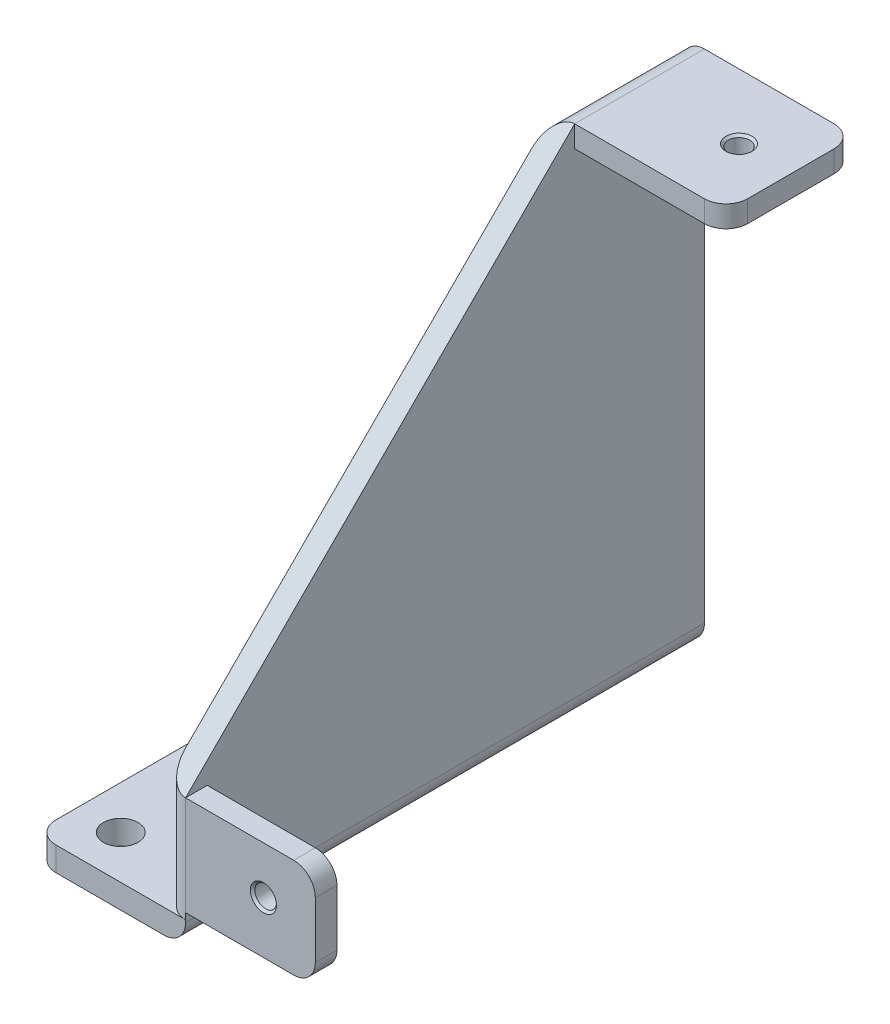
ISO-10303-21;
HEADER;
FILE_DESCRIPTION(('STEP AP214'),'2;1');
FILE_NAME('part.step','',(''),(''),'','','');
FILE_SCHEMA(('AUTOMOTIVE_DESIGN { 1 0 10303 214 1 1 1 1 }'));
ENDSEC;
DATA;
#1=APPLICATION_CONTEXT('core data for automotive mechanical design processes');
#2=APPLICATION_PROTOCOL_DEFINITION('international standard','automotive_design',2000,#1);
#3=PRODUCT_CONTEXT('',#1,'mechanical');
#4=PRODUCT('Part','Part','',(#3));
#5=PRODUCT_RELATED_PRODUCT_CATEGORY('part','',(#4));
#6=PRODUCT_DEFINITION_FORMATION('','',#4);
#7=PRODUCT_DEFINITION_CONTEXT('part definition',#1,'design');
#8=PRODUCT_DEFINITION('design','',#6,#7);
#9=PRODUCT_DEFINITION_SHAPE('','',#8);
#10=(LENGTH_UNIT() NAMED_UNIT(*) SI_UNIT(.MILLI.,.METRE.));
#11=(NAMED_UNIT(*) PLANE_ANGLE_UNIT() SI_UNIT($,.RADIAN.));
#12=(NAMED_UNIT(*) SI_UNIT($,.STERADIAN.) SOLID_ANGLE_UNIT());
#13=UNCERTAINTY_MEASURE_WITH_UNIT(LENGTH_MEASURE(1.E-05),#10,'distance_accuracy_value','');
#14=(GEOMETRIC_REPRESENTATION_CONTEXT(3) GLOBAL_UNCERTAINTY_ASSIGNED_CONTEXT((#13)) GLOBAL_UNIT_ASSIGNED_CONTEXT((#10,
#11,#12)) REPRESENTATION_CONTEXT('',''));
#15=CARTESIAN_POINT('',(0.,0.,0.));
#16=DIRECTION('',(0.,0.,1.));
#17=DIRECTION('',(1.,0.,0.));
#18=AXIS2_PLACEMENT_3D('',#15,#16,#17);
#19=CARTESIAN_POINT('',(5.,30.,0.));
#20=DIRECTION('',(0.,0.,-1.));
#21=DIRECTION('',(0.,1.,0.));
#22=AXIS2_PLACEMENT_3D('',#19,#20,#21);
#23=PLANE('',#22);
#24=CARTESIAN_POINT('',(23.,19.,0.));
#25=DIRECTION('',(0.,0.,1.));
#26=DIRECTION('',(1.,0.,0.));
#27=AXIS2_PLACEMENT_3D('',#24,#25,#26);
#28=CIRCLE('',#27,3.025);
#29=CARTESIAN_POINT('',(26.025,19.,0.));
#30=VERTEX_POINT('',#29);
#31=EDGE_CURVE('E722',#30,#30,#28,.T.);
#32=ORIENTED_EDGE('',*,*,#31,.F.);
#33=EDGE_LOOP('',(#32));
#34=FACE_BOUND('',#33,.T.);
#35=DIRECTION('',(-1.,0.,0.));
#36=VECTOR('',#35,1.);
#37=CARTESIAN_POINT('',(35.,30.,0.));
#38=LINE('',#37,#36);
#39=CARTESIAN_POINT('',(30.,30.,0.));
#40=VERTEX_POINT('',#39);
#41=CARTESIAN_POINT('',(5.,30.,0.));
#42=VERTEX_POINT('',#41);
#43=EDGE_CURVE('E395',#40,#42,#38,.T.);
#44=ORIENTED_EDGE('',*,*,#43,.T.);
#45=DIRECTION('',(0.,-1.,0.));
#46=VECTOR('',#45,1.);
#47=CARTESIAN_POINT('',(5.,30.,0.));
#48=LINE('',#47,#46);
#49=CARTESIAN_POINT('',(5.,7.,0.));
#50=VERTEX_POINT('',#49);
#51=EDGE_CURVE('E312',#42,#50,#48,.T.);
#52=ORIENTED_EDGE('',*,*,#51,.T.);
#53=DIRECTION('',(-1.,0.,0.));
#54=VECTOR('',#53,1.);
#55=CARTESIAN_POINT('',(35.,7.,0.));
#56=LINE('',#55,#54);
#57=CARTESIAN_POINT('',(30.,7.,0.));
#58=VERTEX_POINT('',#57);
#59=EDGE_CURVE('E274',#58,#50,#56,.T.);
#60=ORIENTED_EDGE('',*,*,#59,.F.);
#61=CARTESIAN_POINT('',(30.,12.,0.));
#62=DIRECTION('',(0.,0.,-1.));
#63=DIRECTION('',(0.,1.,0.));
#64=AXIS2_PLACEMENT_3D('',#61,#62,#63);
#65=CIRCLE('',#64,5.);
#66=CARTESIAN_POINT('',(35.,12.,0.));
#67=VERTEX_POINT('',#66);
#68=EDGE_CURVE('E459',#58,#67,#65,.F.);
#69=ORIENTED_EDGE('',*,*,#68,.T.);
#70=DIRECTION('',(0.,-1.,0.));
#71=VECTOR('',#70,1.);
#72=CARTESIAN_POINT('',(35.,7.,0.));
#73=LINE('',#72,#71);
#74=CARTESIAN_POINT('',(35.,25.,0.));
#75=VERTEX_POINT('',#74);
#76=EDGE_CURVE('E388',#75,#67,#73,.T.);
#77=ORIENTED_EDGE('',*,*,#76,.F.);
#78=CARTESIAN_POINT('',(30.,25.,0.));
#79=DIRECTION('',(0.,0.,-1.));
#80=DIRECTION('',(0.,1.,0.));
#81=AXIS2_PLACEMENT_3D('',#78,#79,#80);
#82=CIRCLE('',#81,5.);
#83=EDGE_CURVE('E322',#75,#40,#82,.F.);
#84=ORIENTED_EDGE('',*,*,#83,.T.);
#85=EDGE_LOOP('',(#44,#52,#60,#69,#77,#84));
#86=FACE_BOUND('',#85,.T.);
#87=ADVANCED_FACE('F37',(#34,#86),#23,.F.);
#88=CARTESIAN_POINT('',(5.,0.,0.));
#89=DIRECTION('',(1.,0.,0.));
#90=DIRECTION('',(0.,0.,-1.));
#91=AXIS2_PLACEMENT_3D('',#88,#89,#90);
#92=PLANE('',#91);
#93=DIRECTION('',(0.,-1.,0.));
#94=VECTOR('',#93,1.);
#95=CARTESIAN_POINT('',(5.,30.,0.));
#96=LINE('',#95,#94);
#97=CARTESIAN_POINT('',(5.,5.57131604610106,0.));
#98=VERTEX_POINT('',#97);
#99=CARTESIAN_POINT('',(5.,5.,0.));
#100=VERTEX_POINT('',#99);
#101=EDGE_CURVE('E272',#98,#100,#96,.T.);
#102=ORIENTED_EDGE('',*,*,#101,.T.);
#103=DIRECTION('',(0.,0.,-1.));
#104=VECTOR('',#103,1.);
#105=CARTESIAN_POINT('',(5.,5.,-120.));
#106=LINE('',#105,#104);
#107=CARTESIAN_POINT('',(5.,5.,-120.));
#108=VERTEX_POINT('',#107);
#109=EDGE_CURVE('E316',#100,#108,#106,.T.);
#110=ORIENTED_EDGE('',*,*,#109,.T.);
#111=DIRECTION('',(0.,1.,0.));
#112=VECTOR('',#111,1.);
#113=CARTESIAN_POINT('',(5.,0.,-120.));
#114=LINE('',#113,#112);
#115=CARTESIAN_POINT('',(5.,115.,-120.));
#116=VERTEX_POINT('',#115);
#117=EDGE_CURVE('E233',#108,#116,#114,.T.);
#118=ORIENTED_EDGE('',*,*,#117,.T.);
#119=DIRECTION('',(0.,0.,-1.));
#120=VECTOR('',#119,1.);
#121=CARTESIAN_POINT('',(5.,115.,-120.));
#122=LINE('',#121,#120);
#123=CARTESIAN_POINT('',(5.,115.,-90.));
#124=VERTEX_POINT('',#123);
#125=EDGE_CURVE('E227',#124,#116,#122,.T.);
#126=ORIENTED_EDGE('',*,*,#125,.F.);
#127=DIRECTION('',(0.,-1.,0.));
#128=VECTOR('',#127,1.);
#129=CARTESIAN_POINT('',(5.,120.,-90.));
#130=LINE('',#129,#128);
#131=CARTESIAN_POINT('',(5.,120.,-90.));
#132=VERTEX_POINT('',#131);
#133=EDGE_CURVE('E212',#132,#124,#130,.T.);
#134=ORIENTED_EDGE('',*,*,#133,.F.);
#135=DIRECTION('',(0.,-0.707106781186548,0.707106781186548));
#136=VECTOR('',#135,1.);
#137=CARTESIAN_POINT('',(5.,120.,-90.));
#138=LINE('',#137,#136);
#139=EDGE_CURVE('E224',#132,#42,#138,.T.);
#140=ORIENTED_EDGE('',*,*,#139,.T.);
#141=DIRECTION('',(0.,0.,1.));
#142=VECTOR('',#141,1.);
#143=CARTESIAN_POINT('',(5.,30.,0.));
#144=LINE('',#143,#142);
#145=CARTESIAN_POINT('',(5.,30.,-5.));
#146=VERTEX_POINT('',#145);
#147=EDGE_CURVE('E392',#146,#42,#144,.T.);
#148=ORIENTED_EDGE('',*,*,#147,.F.);
#149=DIRECTION('',(0.,1.,0.));
#150=VECTOR('',#149,1.);
#151=CARTESIAN_POINT('',(5.,7.,-5.));
#152=LINE('',#151,#150);
#153=CARTESIAN_POINT('',(5.,7.,-5.));
#154=VERTEX_POINT('',#153);
#155=EDGE_CURVE('E286',#154,#146,#152,.T.);
#156=ORIENTED_EDGE('',*,*,#155,.F.);
#157=DIRECTION('',(0.,0.,-1.));
#158=VECTOR('',#157,1.);
#159=CARTESIAN_POINT('',(5.,7.,0.));
#160=LINE('',#159,#158);
#161=EDGE_CURVE('E216',#50,#154,#160,.T.);
#162=ORIENTED_EDGE('',*,*,#161,.F.);
#163=EDGE_CURVE('E237',#50,#98,#96,.T.);
#164=ORIENTED_EDGE('',*,*,#163,.T.);
#165=EDGE_LOOP('',(#102,#110,#118,#126,#134,#140,#148,#156,#162,#164));
#166=FACE_BOUND('',#165,.T.);
#167=ADVANCED_FACE('F222',(#166),#92,.T.);
#168=CARTESIAN_POINT('',(0.,0.,0.));
#169=DIRECTION('',(1.,0.,0.));
#170=DIRECTION('',(0.,0.,-1.));
#171=AXIS2_PLACEMENT_3D('',#168,#169,#170);
#172=PLANE('',#171);
#173=DIRECTION('',(0.,-0.707106781186548,0.707106781186548));
#174=VECTOR('',#173,1.);
#175=CARTESIAN_POINT('',(0.,120.,-90.));
#176=LINE('',#175,#174);
#177=CARTESIAN_POINT('',(0.,115.,-85.));
#178=VERTEX_POINT('',#177);
#179=CARTESIAN_POINT('',(0.,35.,-5.));
#180=VERTEX_POINT('',#179);
#181=EDGE_CURVE('E243',#178,#180,#176,.T.);
#182=ORIENTED_EDGE('',*,*,#181,.F.);
#183=DIRECTION('',(0.,0.,1.));
#184=VECTOR('',#183,1.);
#185=CARTESIAN_POINT('',(0.,115.,0.));
#186=LINE('',#185,#184);
#187=CARTESIAN_POINT('',(0.,115.,-120.));
#188=VERTEX_POINT('',#187);
#189=EDGE_CURVE('E188',#178,#188,#186,.F.);
#190=ORIENTED_EDGE('',*,*,#189,.T.);
#191=DIRECTION('',(0.,1.,0.));
#192=VECTOR('',#191,1.);
#193=CARTESIAN_POINT('',(0.,0.,-120.));
#194=LINE('',#193,#192);
#195=CARTESIAN_POINT('',(0.,5.57131604610106,-120.));
#196=VERTEX_POINT('',#195);
#197=EDGE_CURVE('E245',#196,#188,#194,.T.);
#198=ORIENTED_EDGE('',*,*,#197,.F.);
#199=DIRECTION('',(0.,0.,-1.));
#200=VECTOR('',#199,1.);
#201=CARTESIAN_POINT('',(0.,5.57131604610106,0.));
#202=LINE('',#201,#200);
#203=CARTESIAN_POINT('',(0.,5.57131604610106,-5.));
#204=VERTEX_POINT('',#203);
#205=EDGE_CURVE('E294',#204,#196,#202,.T.);
#206=ORIENTED_EDGE('',*,*,#205,.F.);
#207=DIRECTION('',(0.,-1.,0.));
#208=VECTOR('',#207,1.);
#209=CARTESIAN_POINT('',(0.,0.,-5.));
#210=LINE('',#209,#208);
#211=EDGE_CURVE('E193',#204,#180,#210,.F.);
#212=ORIENTED_EDGE('',*,*,#211,.T.);
#213=EDGE_LOOP('',(#182,#190,#198,#206,#212));
#214=FACE_BOUND('',#213,.T.);
#215=ADVANCED_FACE('F301',(#214),#172,.F.);
#216=ORIENTED_EDGE('',*,*,#101,.F.);
#217=DIRECTION('',(1.,0.,0.));
#218=VECTOR('',#217,1.);
#219=CARTESIAN_POINT('',(-30.,5.57131604610106,0.));
#220=LINE('',#219,#218);
#221=CARTESIAN_POINT('',(-25.,5.57131604610106,0.));
#222=VERTEX_POINT('',#221);
#223=EDGE_CURVE('E249',#222,#98,#220,.T.);
#224=ORIENTED_EDGE('',*,*,#223,.F.);
#225=DIRECTION('',(0.,1.,0.));
#226=VECTOR('',#225,1.);
#227=CARTESIAN_POINT('',(-25.,0.,0.));
#228=LINE('',#227,#226);
#229=CARTESIAN_POINT('',(-25.,0.,0.));
#230=VERTEX_POINT('',#229);
#231=EDGE_CURVE('E270',#222,#230,#228,.F.);
#232=ORIENTED_EDGE('',*,*,#231,.T.);
#233=DIRECTION('',(-1.,0.,0.));
#234=VECTOR('',#233,1.);
#235=CARTESIAN_POINT('',(5.,0.,0.));
#236=LINE('',#235,#234);
#237=CARTESIAN_POINT('',(0.,0.,0.));
#238=VERTEX_POINT('',#237);
#239=EDGE_CURVE('E250',#238,#230,#236,.T.);
#240=ORIENTED_EDGE('',*,*,#239,.F.);
#241=CARTESIAN_POINT('',(0.,5.,0.));
#242=DIRECTION('',(0.,0.,-1.));
#243=DIRECTION('',(0.,1.,0.));
#244=AXIS2_PLACEMENT_3D('',#241,#242,#243);
#245=CIRCLE('',#244,5.);
#246=EDGE_CURVE('E317',#238,#100,#245,.F.);
#247=ORIENTED_EDGE('',*,*,#246,.T.);
#248=EDGE_LOOP('',(#216,#224,#232,#240,#247));
#249=FACE_BOUND('',#248,.T.);
#250=ADVANCED_FACE('F433',(#249),#23,.F.);
#251=CARTESIAN_POINT('',(5.,0.,0.));
#252=DIRECTION('',(0.,1.,0.));
#253=DIRECTION('',(0.,0.,1.));
#254=AXIS2_PLACEMENT_3D('',#251,#252,#253);
#255=PLANE('',#254);
#256=CARTESIAN_POINT('',(-20.,0.,-10.));
#257=DIRECTION('',(0.,1.,0.));
#258=DIRECTION('',(0.,0.,1.));
#259=AXIS2_PLACEMENT_3D('',#256,#257,#258);
#260=CIRCLE('',#259,4.);
#261=CARTESIAN_POINT('',(-20.,0.,-6.));
#262=VERTEX_POINT('',#261);
#263=EDGE_CURVE('E711',#262,#262,#260,.T.);
#264=ORIENTED_EDGE('',*,*,#263,.T.);
#265=EDGE_LOOP('',(#264));
#266=FACE_BOUND('',#265,.T.);
#267=CARTESIAN_POINT('',(-20.,0.,-110.));
#268=DIRECTION('',(0.,1.,0.));
#269=DIRECTION('',(0.,0.,1.));
#270=AXIS2_PLACEMENT_3D('',#267,#268,#269);
#271=CIRCLE('',#270,4.);
#272=CARTESIAN_POINT('',(-20.,0.,-106.));
#273=VERTEX_POINT('',#272);
#274=EDGE_CURVE('E719',#273,#273,#271,.T.);
#275=ORIENTED_EDGE('',*,*,#274,.T.);
#276=EDGE_LOOP('',(#275));
#277=FACE_BOUND('',#276,.T.);
#278=DIRECTION('',(-1.,0.,0.));
#279=VECTOR('',#278,1.);
#280=CARTESIAN_POINT('',(5.,0.,-120.));
#281=LINE('',#280,#279);
#282=CARTESIAN_POINT('',(0.,0.,-120.));
#283=VERTEX_POINT('',#282);
#284=CARTESIAN_POINT('',(-25.,0.,-120.));
#285=VERTEX_POINT('',#284);
#286=EDGE_CURVE('E235',#283,#285,#281,.T.);
#287=ORIENTED_EDGE('',*,*,#286,.F.);
#288=DIRECTION('',(0.,0.,-1.));
#289=VECTOR('',#288,1.);
#290=CARTESIAN_POINT('',(0.,0.,0.));
#291=LINE('',#290,#289);
#292=EDGE_CURVE('E331',#283,#238,#291,.F.);
#293=ORIENTED_EDGE('',*,*,#292,.T.);
#294=ORIENTED_EDGE('',*,*,#239,.T.);
#295=CARTESIAN_POINT('',(-25.,0.,-5.));
#296=DIRECTION('',(0.,1.,0.));
#297=DIRECTION('',(0.,0.,1.));
#298=AXIS2_PLACEMENT_3D('',#295,#296,#297);
#299=CIRCLE('',#298,5.);
#300=CARTESIAN_POINT('',(-30.,0.,-5.));
#301=VERTEX_POINT('',#300);
#302=EDGE_CURVE('E329',#230,#301,#299,.F.);
#303=ORIENTED_EDGE('',*,*,#302,.T.);
#304=DIRECTION('',(0.,0.,1.));
#305=VECTOR('',#304,1.);
#306=CARTESIAN_POINT('',(-30.,0.,0.));
#307=LINE('',#306,#305);
#308=CARTESIAN_POINT('',(-30.,0.,-115.));
#309=VERTEX_POINT('',#308);
#310=EDGE_CURVE('E260',#309,#301,#307,.T.);
#311=ORIENTED_EDGE('',*,*,#310,.F.);
#312=CARTESIAN_POINT('',(-25.,0.,-115.));
#313=DIRECTION('',(0.,1.,0.));
#314=DIRECTION('',(0.,0.,1.));
#315=AXIS2_PLACEMENT_3D('',#312,#313,#314);
#316=CIRCLE('',#315,5.);
#317=EDGE_CURVE('E320',#309,#285,#316,.F.);
#318=ORIENTED_EDGE('',*,*,#317,.T.);
#319=EDGE_LOOP('',(#287,#293,#294,#303,#311,#318));
#320=FACE_BOUND('',#319,.T.);
#321=ADVANCED_FACE('F414',(#266,#277,#320),#255,.F.);
#322=CARTESIAN_POINT('',(5.,0.,-120.));
#323=DIRECTION('',(0.,0.,1.));
#324=DIRECTION('',(1.,0.,0.));
#325=AXIS2_PLACEMENT_3D('',#322,#323,#324);
#326=PLANE('',#325);
#327=ORIENTED_EDGE('',*,*,#197,.T.);
#328=CARTESIAN_POINT('',(5.,115.,-120.));
#329=DIRECTION('',(0.,0.,1.));
#330=DIRECTION('',(1.,0.,0.));
#331=AXIS2_PLACEMENT_3D('',#328,#329,#330);
#332=CIRCLE('',#331,5.);
#333=CARTESIAN_POINT('',(5.,120.,-120.));
#334=VERTEX_POINT('',#333);
#335=EDGE_CURVE('E268',#188,#334,#332,.F.);
#336=ORIENTED_EDGE('',*,*,#335,.T.);
#337=DIRECTION('',(-1.,0.,0.));
#338=VECTOR('',#337,1.);
#339=CARTESIAN_POINT('',(5.,120.,-120.));
#340=LINE('',#339,#338);
#341=CARTESIAN_POINT('',(35.,120.,-120.));
#342=VERTEX_POINT('',#341);
#343=EDGE_CURVE('E204',#342,#334,#340,.T.);
#344=ORIENTED_EDGE('',*,*,#343,.F.);
#345=DIRECTION('',(0.,1.,0.));
#346=VECTOR('',#345,1.);
#347=CARTESIAN_POINT('',(35.,0.,-120.));
#348=LINE('',#347,#346);
#349=CARTESIAN_POINT('',(35.,115.,-120.));
#350=VERTEX_POINT('',#349);
#351=EDGE_CURVE('E264',#342,#350,#348,.F.);
#352=ORIENTED_EDGE('',*,*,#351,.T.);
#353=DIRECTION('',(-1.,0.,0.));
#354=VECTOR('',#353,1.);
#355=CARTESIAN_POINT('',(40.,115.,-120.));
#356=LINE('',#355,#354);
#357=EDGE_CURVE('E382',#350,#116,#356,.T.);
#358=ORIENTED_EDGE('',*,*,#357,.T.);
#359=ORIENTED_EDGE('',*,*,#117,.F.);
#360=CARTESIAN_POINT('',(0.,5.,-120.));
#361=DIRECTION('',(0.,0.,1.));
#362=DIRECTION('',(1.,0.,0.));
#363=AXIS2_PLACEMENT_3D('',#360,#361,#362);
#364=CIRCLE('',#363,5.);
#365=EDGE_CURVE('E266',#108,#283,#364,.F.);
#366=ORIENTED_EDGE('',*,*,#365,.T.);
#367=ORIENTED_EDGE('',*,*,#286,.T.);
#368=DIRECTION('',(0.,-1.,0.));
#369=VECTOR('',#368,1.);
#370=CARTESIAN_POINT('',(-25.,5.57131604610106,-120.));
#371=LINE('',#370,#369);
#372=CARTESIAN_POINT('',(-25.,5.57131604610106,-120.));
#373=VERTEX_POINT('',#372);
#374=EDGE_CURVE('E262',#285,#373,#371,.F.);
#375=ORIENTED_EDGE('',*,*,#374,.T.);
#376=DIRECTION('',(1.,0.,0.));
#377=VECTOR('',#376,1.);
#378=CARTESIAN_POINT('',(-30.,5.57131604610106,-120.));
#379=LINE('',#378,#377);
#380=EDGE_CURVE('E257',#373,#196,#379,.T.);
#381=ORIENTED_EDGE('',*,*,#380,.T.);
#382=EDGE_LOOP('',(#327,#336,#344,#352,#358,#359,#366,#367,#375,#381));
#383=FACE_BOUND('',#382,.T.);
#384=ADVANCED_FACE('F303',(#383),#326,.F.);
#385=CARTESIAN_POINT('',(5.,120.,-120.));
#386=DIRECTION('',(0.,-1.,0.));
#387=DIRECTION('',(0.,0.,-1.));
#388=AXIS2_PLACEMENT_3D('',#385,#386,#387);
#389=PLANE('',#388);
#390=CARTESIAN_POINT('',(28.,120.,-105.));
#391=DIRECTION('',(0.,1.,0.));
#392=DIRECTION('',(0.,0.,1.));
#393=AXIS2_PLACEMENT_3D('',#390,#391,#392);
#394=CIRCLE('',#393,3.025);
#395=CARTESIAN_POINT('',(28.,120.,-101.975));
#396=VERTEX_POINT('',#395);
#397=EDGE_CURVE('E369',#396,#396,#394,.T.);
#398=ORIENTED_EDGE('',*,*,#397,.F.);
#399=EDGE_LOOP('',(#398));
#400=FACE_BOUND('',#399,.T.);
#401=ORIENTED_EDGE('',*,*,#343,.T.);
#402=DIRECTION('',(0.,0.,1.));
#403=VECTOR('',#402,1.);
#404=CARTESIAN_POINT('',(5.,120.,-120.));
#405=LINE('',#404,#403);
#406=EDGE_CURVE('E187',#334,#132,#405,.T.);
#407=ORIENTED_EDGE('',*,*,#406,.T.);
#408=DIRECTION('',(-1.,0.,0.));
#409=VECTOR('',#408,1.);
#410=CARTESIAN_POINT('',(40.,120.,-90.));
#411=LINE('',#410,#409);
#412=CARTESIAN_POINT('',(35.,120.,-90.));
#413=VERTEX_POINT('',#412);
#414=EDGE_CURVE('E201',#413,#132,#411,.T.);
#415=ORIENTED_EDGE('',*,*,#414,.F.);
#416=CARTESIAN_POINT('',(35.,120.,-95.));
#417=DIRECTION('',(0.,-1.,0.));
#418=DIRECTION('',(0.,0.,-1.));
#419=AXIS2_PLACEMENT_3D('',#416,#417,#418);
#420=CIRCLE('',#419,5.);
#421=CARTESIAN_POINT('',(40.,120.,-95.));
#422=VERTEX_POINT('',#421);
#423=EDGE_CURVE('E290',#413,#422,#420,.F.);
#424=ORIENTED_EDGE('',*,*,#423,.T.);
#425=DIRECTION('',(0.,0.,1.));
#426=VECTOR('',#425,1.);
#427=CARTESIAN_POINT('',(40.,120.,-120.));
#428=LINE('',#427,#426);
#429=CARTESIAN_POINT('',(40.,120.,-115.));
#430=VERTEX_POINT('',#429);
#431=EDGE_CURVE('E377',#430,#422,#428,.T.);
#432=ORIENTED_EDGE('',*,*,#431,.F.);
#433=CARTESIAN_POINT('',(35.,120.,-115.));
#434=DIRECTION('',(0.,-1.,0.));
#435=DIRECTION('',(0.,0.,-1.));
#436=AXIS2_PLACEMENT_3D('',#433,#434,#435);
#437=CIRCLE('',#436,5.);
#438=EDGE_CURVE('E205',#430,#342,#437,.F.);
#439=ORIENTED_EDGE('',*,*,#438,.T.);
#440=EDGE_LOOP('',(#401,#407,#415,#424,#432,#439));
#441=FACE_BOUND('',#440,.T.);
#442=ADVANCED_FACE('F200',(#400,#441),#389,.F.);
#443=CARTESIAN_POINT('',(5.,120.,-90.));
#444=DIRECTION('',(0.,-0.707106781186548,-0.707106781186548));
#445=DIRECTION('',(0.,0.707106781186548,-0.707106781186548));
#446=AXIS2_PLACEMENT_3D('',#443,#444,#445);
#447=PLANE('',#446);
#448=ORIENTED_EDGE('',*,*,#139,.F.);
#449=CARTESIAN_POINT('',(5.,115.,-85.));
#450=DIRECTION('',(0.,-0.707106781186548,-0.707106781186548));
#451=DIRECTION('',(0.,-0.707106781186548,0.707106781186548));
#452=AXIS2_PLACEMENT_3D('',#449,#450,#451);
#453=ELLIPSE('',#452,7.07106781186547,5.);
#454=EDGE_CURVE('E183',#132,#178,#453,.F.);
#455=ORIENTED_EDGE('',*,*,#454,.T.);
#456=ORIENTED_EDGE('',*,*,#181,.T.);
#457=CARTESIAN_POINT('',(5.,35.,-5.));
#458=DIRECTION('',(0.,-0.707106781186548,-0.707106781186548));
#459=DIRECTION('',(0.,-0.707106781186548,0.707106781186548));
#460=AXIS2_PLACEMENT_3D('',#457,#458,#459);
#461=ELLIPSE('',#460,7.07106781186547,5.);
#462=EDGE_CURVE('E194',#180,#42,#461,.F.);
#463=ORIENTED_EDGE('',*,*,#462,.T.);
#464=EDGE_LOOP('',(#448,#455,#456,#463));
#465=FACE_BOUND('',#464,.T.);
#466=ADVANCED_FACE('F231',(#465),#447,.F.);
#467=CARTESIAN_POINT('',(-30.,5.57131604610106,0.));
#468=DIRECTION('',(0.,-1.,0.));
#469=DIRECTION('',(0.,0.,-1.));
#470=AXIS2_PLACEMENT_3D('',#467,#468,#469);
#471=PLANE('',#470);
#472=CARTESIAN_POINT('',(-20.,5.57131604610106,-10.));
#473=DIRECTION('',(0.,1.,0.));
#474=DIRECTION('',(0.,0.,1.));
#475=AXIS2_PLACEMENT_3D('',#472,#473,#474);
#476=CIRCLE('',#475,4.);
#477=CARTESIAN_POINT('',(-20.,5.57131604610106,-6.));
#478=VERTEX_POINT('',#477);
#479=EDGE_CURVE('E714',#478,#478,#476,.T.);
#480=ORIENTED_EDGE('',*,*,#479,.F.);
#481=EDGE_LOOP('',(#480));
#482=FACE_BOUND('',#481,.T.);
#483=CARTESIAN_POINT('',(-20.,5.57131604610106,-110.));
#484=DIRECTION('',(0.,1.,0.));
#485=DIRECTION('',(0.,0.,1.));
#486=AXIS2_PLACEMENT_3D('',#483,#484,#485);
#487=CIRCLE('',#486,4.);
#488=CARTESIAN_POINT('',(-20.,5.57131604610106,-106.));
#489=VERTEX_POINT('',#488);
#490=EDGE_CURVE('E716',#489,#489,#487,.T.);
#491=ORIENTED_EDGE('',*,*,#490,.F.);
#492=EDGE_LOOP('',(#491));
#493=FACE_BOUND('',#492,.T.);
#494=DIRECTION('',(0.,0.,-1.));
#495=VECTOR('',#494,1.);
#496=CARTESIAN_POINT('',(-30.,5.57131604610106,0.));
#497=LINE('',#496,#495);
#498=CARTESIAN_POINT('',(-30.,5.57131604610106,-5.));
#499=VERTEX_POINT('',#498);
#500=CARTESIAN_POINT('',(-30.,5.57131604610106,-115.));
#501=VERTEX_POINT('',#500);
#502=EDGE_CURVE('E296',#499,#501,#497,.T.);
#503=ORIENTED_EDGE('',*,*,#502,.F.);
#504=CARTESIAN_POINT('',(-25.,5.57131604610106,-5.));
#505=DIRECTION('',(0.,-1.,0.));
#506=DIRECTION('',(0.,0.,-1.));
#507=AXIS2_PLACEMENT_3D('',#504,#505,#506);
#508=CIRCLE('',#507,5.);
#509=EDGE_CURVE('E46',#499,#222,#508,.F.);
#510=ORIENTED_EDGE('',*,*,#509,.T.);
#511=ORIENTED_EDGE('',*,*,#223,.T.);
#512=CARTESIAN_POINT('',(5.,5.57131604610106,-5.));
#513=DIRECTION('',(0.,-1.,0.));
#514=DIRECTION('',(0.,0.,-1.));
#515=AXIS2_PLACEMENT_3D('',#512,#513,#514);
#516=CIRCLE('',#515,5.);
#517=EDGE_CURVE('E11',#98,#204,#516,.T.);
#518=ORIENTED_EDGE('',*,*,#517,.T.);
#519=ORIENTED_EDGE('',*,*,#205,.T.);
#520=ORIENTED_EDGE('',*,*,#380,.F.);
#521=CARTESIAN_POINT('',(-25.,5.57131604610106,-115.));
#522=DIRECTION('',(0.,-1.,0.));
#523=DIRECTION('',(0.,0.,-1.));
#524=AXIS2_PLACEMENT_3D('',#521,#522,#523);
#525=CIRCLE('',#524,5.);
#526=EDGE_CURVE('E54',#373,#501,#525,.F.);
#527=ORIENTED_EDGE('',*,*,#526,.T.);
#528=EDGE_LOOP('',(#503,#510,#511,#518,#519,#520,#527));
#529=FACE_BOUND('',#528,.T.);
#530=ADVANCED_FACE('F306',(#482,#493,#529),#471,.F.);
#531=CARTESIAN_POINT('',(-30.,0.,0.));
#532=DIRECTION('',(-1.,0.,0.));
#533=DIRECTION('',(0.,0.,1.));
#534=AXIS2_PLACEMENT_3D('',#531,#532,#533);
#535=PLANE('',#534);
#536=ORIENTED_EDGE('',*,*,#310,.T.);
#537=DIRECTION('',(0.,1.,0.));
#538=VECTOR('',#537,1.);
#539=CARTESIAN_POINT('',(-30.,5.57131604610106,-5.));
#540=LINE('',#539,#538);
#541=EDGE_CURVE('E361',#301,#499,#540,.T.);
#542=ORIENTED_EDGE('',*,*,#541,.T.);
#543=ORIENTED_EDGE('',*,*,#502,.T.);
#544=DIRECTION('',(0.,-1.,0.));
#545=VECTOR('',#544,1.);
#546=CARTESIAN_POINT('',(-30.,0.,-115.));
#547=LINE('',#546,#545);
#548=EDGE_CURVE('E358',#501,#309,#547,.T.);
#549=ORIENTED_EDGE('',*,*,#548,.T.);
#550=EDGE_LOOP('',(#536,#542,#543,#549));
#551=FACE_BOUND('',#550,.T.);
#552=ADVANCED_FACE('F407',(#551),#535,.T.);
#553=CARTESIAN_POINT('',(35.,7.,0.));
#554=DIRECTION('',(0.,1.,0.));
#555=DIRECTION('',(0.,0.,1.));
#556=AXIS2_PLACEMENT_3D('',#553,#554,#555);
#557=PLANE('',#556);
#558=DIRECTION('',(-1.,0.,0.));
#559=VECTOR('',#558,1.);
#560=CARTESIAN_POINT('',(35.,7.,-5.));
#561=LINE('',#560,#559);
#562=CARTESIAN_POINT('',(30.,7.,-5.));
#563=VERTEX_POINT('',#562);
#564=EDGE_CURVE('E402',#563,#154,#561,.T.);
#565=ORIENTED_EDGE('',*,*,#564,.F.);
#566=DIRECTION('',(0.,0.,-1.));
#567=VECTOR('',#566,1.);
#568=CARTESIAN_POINT('',(30.,7.,0.));
#569=LINE('',#568,#567);
#570=EDGE_CURVE('E356',#563,#58,#569,.F.);
#571=ORIENTED_EDGE('',*,*,#570,.T.);
#572=ORIENTED_EDGE('',*,*,#59,.T.);
#573=ORIENTED_EDGE('',*,*,#161,.T.);
#574=EDGE_LOOP('',(#565,#571,#572,#573));
#575=FACE_BOUND('',#574,.T.);
#576=ADVANCED_FACE('F455',(#575),#557,.F.);
#577=CARTESIAN_POINT('',(35.,7.,-5.));
#578=DIRECTION('',(0.,0.,1.));
#579=DIRECTION('',(1.,0.,0.));
#580=AXIS2_PLACEMENT_3D('',#577,#578,#579);
#581=PLANE('',#580);
#582=CARTESIAN_POINT('',(23.,19.,-5.));
#583=DIRECTION('',(0.,0.,1.));
#584=DIRECTION('',(1.,0.,0.));
#585=AXIS2_PLACEMENT_3D('',#582,#583,#584);
#586=CIRCLE('',#585,2.49999999999998);
#587=CARTESIAN_POINT('',(25.5,19.,-5.));
#588=VERTEX_POINT('',#587);
#589=EDGE_CURVE('E41',#588,#588,#586,.T.);
#590=ORIENTED_EDGE('',*,*,#589,.T.);
#591=EDGE_LOOP('',(#590));
#592=FACE_BOUND('',#591,.T.);
#593=DIRECTION('',(-1.,0.,0.));
#594=VECTOR('',#593,1.);
#595=CARTESIAN_POINT('',(35.,30.,-5.));
#596=LINE('',#595,#594);
#597=CARTESIAN_POINT('',(30.,30.,-5.));
#598=VERTEX_POINT('',#597);
#599=EDGE_CURVE('E400',#598,#146,#596,.T.);
#600=ORIENTED_EDGE('',*,*,#599,.F.);
#601=CARTESIAN_POINT('',(30.,25.,-5.));
#602=DIRECTION('',(0.,0.,1.));
#603=DIRECTION('',(1.,0.,0.));
#604=AXIS2_PLACEMENT_3D('',#601,#602,#603);
#605=CIRCLE('',#604,5.);
#606=CARTESIAN_POINT('',(35.,25.,-5.));
#607=VERTEX_POINT('',#606);
#608=EDGE_CURVE('E354',#598,#607,#605,.F.);
#609=ORIENTED_EDGE('',*,*,#608,.T.);
#610=DIRECTION('',(0.,1.,0.));
#611=VECTOR('',#610,1.);
#612=CARTESIAN_POINT('',(35.,7.,-5.));
#613=LINE('',#612,#611);
#614=CARTESIAN_POINT('',(35.,12.,-5.));
#615=VERTEX_POINT('',#614);
#616=EDGE_CURVE('E391',#615,#607,#613,.T.);
#617=ORIENTED_EDGE('',*,*,#616,.F.);
#618=CARTESIAN_POINT('',(30.,12.,-5.));
#619=DIRECTION('',(0.,0.,1.));
#620=DIRECTION('',(1.,0.,0.));
#621=AXIS2_PLACEMENT_3D('',#618,#619,#620);
#622=CIRCLE('',#621,5.);
#623=EDGE_CURVE('E352',#615,#563,#622,.F.);
#624=ORIENTED_EDGE('',*,*,#623,.T.);
#625=ORIENTED_EDGE('',*,*,#564,.T.);
#626=ORIENTED_EDGE('',*,*,#155,.T.);
#627=EDGE_LOOP('',(#600,#609,#617,#624,#625,#626));
#628=FACE_BOUND('',#627,.T.);
#629=ADVANCED_FACE('F474',(#592,#628),#581,.F.);
#630=CARTESIAN_POINT('',(35.,30.,0.));
#631=DIRECTION('',(0.,-1.,0.));
#632=DIRECTION('',(0.,0.,-1.));
#633=AXIS2_PLACEMENT_3D('',#630,#631,#632);
#634=PLANE('',#633);
#635=ORIENTED_EDGE('',*,*,#43,.F.);
#636=DIRECTION('',(0.,0.,1.));
#637=VECTOR('',#636,1.);
#638=CARTESIAN_POINT('',(30.,30.,0.));
#639=LINE('',#638,#637);
#640=EDGE_CURVE('E350',#40,#598,#639,.F.);
#641=ORIENTED_EDGE('',*,*,#640,.T.);
#642=ORIENTED_EDGE('',*,*,#599,.T.);
#643=ORIENTED_EDGE('',*,*,#147,.T.);
#644=EDGE_LOOP('',(#635,#641,#642,#643));
#645=FACE_BOUND('',#644,.T.);
#646=ADVANCED_FACE('F468',(#645),#634,.F.);
#647=CARTESIAN_POINT('',(35.,0.,0.));
#648=DIRECTION('',(-1.,0.,0.));
#649=DIRECTION('',(0.,0.,1.));
#650=AXIS2_PLACEMENT_3D('',#647,#648,#649);
#651=PLANE('',#650);
#652=ORIENTED_EDGE('',*,*,#616,.T.);
#653=DIRECTION('',(0.,0.,1.));
#654=VECTOR('',#653,1.);
#655=CARTESIAN_POINT('',(35.,25.,0.));
#656=LINE('',#655,#654);
#657=EDGE_CURVE('E347',#607,#75,#656,.T.);
#658=ORIENTED_EDGE('',*,*,#657,.T.);
#659=ORIENTED_EDGE('',*,*,#76,.T.);
#660=DIRECTION('',(0.,0.,-1.));
#661=VECTOR('',#660,1.);
#662=CARTESIAN_POINT('',(35.,12.,0.));
#663=LINE('',#662,#661);
#664=EDGE_CURVE('E344',#67,#615,#663,.T.);
#665=ORIENTED_EDGE('',*,*,#664,.T.);
#666=EDGE_LOOP('',(#652,#658,#659,#665));
#667=FACE_BOUND('',#666,.T.);
#668=ADVANCED_FACE('F476',(#667),#651,.F.);
#669=CARTESIAN_POINT('',(40.,120.,-90.));
#670=DIRECTION('',(0.,0.,-1.));
#671=DIRECTION('',(-1.,0.,0.));
#672=AXIS2_PLACEMENT_3D('',#669,#670,#671);
#673=PLANE('',#672);
#674=DIRECTION('',(-1.,0.,0.));
#675=VECTOR('',#674,1.);
#676=CARTESIAN_POINT('',(40.,115.,-90.));
#677=LINE('',#676,#675);
#678=CARTESIAN_POINT('',(35.,115.,-90.));
#679=VERTEX_POINT('',#678);
#680=EDGE_CURVE('E217',#679,#124,#677,.T.);
#681=ORIENTED_EDGE('',*,*,#680,.F.);
#682=DIRECTION('',(0.,-1.,0.));
#683=VECTOR('',#682,1.);
#684=CARTESIAN_POINT('',(35.,120.,-90.));
#685=LINE('',#684,#683);
#686=EDGE_CURVE('E215',#679,#413,#685,.F.);
#687=ORIENTED_EDGE('',*,*,#686,.T.);
#688=ORIENTED_EDGE('',*,*,#414,.T.);
#689=ORIENTED_EDGE('',*,*,#133,.T.);
#690=EDGE_LOOP('',(#681,#687,#688,#689));
#691=FACE_BOUND('',#690,.T.);
#692=ADVANCED_FACE('F211',(#691),#673,.F.);
#693=CARTESIAN_POINT('',(40.,115.,-120.));
#694=DIRECTION('',(0.,1.,0.));
#695=DIRECTION('',(0.,0.,1.));
#696=AXIS2_PLACEMENT_3D('',#693,#694,#695);
#697=PLANE('',#696);
#698=CARTESIAN_POINT('',(28.,115.,-105.));
#699=DIRECTION('',(0.,1.,0.));
#700=DIRECTION('',(0.,0.,1.));
#701=AXIS2_PLACEMENT_3D('',#698,#699,#700);
#702=CIRCLE('',#701,2.49999999999998);
#703=CARTESIAN_POINT('',(28.,115.,-102.5));
#704=VERTEX_POINT('',#703);
#705=EDGE_CURVE('E228',#704,#704,#702,.T.);
#706=ORIENTED_EDGE('',*,*,#705,.T.);
#707=EDGE_LOOP('',(#706));
#708=FACE_BOUND('',#707,.T.);
#709=ORIENTED_EDGE('',*,*,#357,.F.);
#710=CARTESIAN_POINT('',(35.,115.,-115.));
#711=DIRECTION('',(0.,1.,0.));
#712=DIRECTION('',(0.,0.,1.));
#713=AXIS2_PLACEMENT_3D('',#710,#711,#712);
#714=CIRCLE('',#713,5.);
#715=CARTESIAN_POINT('',(40.,115.,-115.));
#716=VERTEX_POINT('',#715);
#717=EDGE_CURVE('E341',#350,#716,#714,.F.);
#718=ORIENTED_EDGE('',*,*,#717,.T.);
#719=DIRECTION('',(0.,0.,-1.));
#720=VECTOR('',#719,1.);
#721=CARTESIAN_POINT('',(40.,115.,-120.));
#722=LINE('',#721,#720);
#723=CARTESIAN_POINT('',(40.,115.,-95.));
#724=VERTEX_POINT('',#723);
#725=EDGE_CURVE('E380',#724,#716,#722,.T.);
#726=ORIENTED_EDGE('',*,*,#725,.F.);
#727=CARTESIAN_POINT('',(35.,115.,-95.));
#728=DIRECTION('',(0.,1.,0.));
#729=DIRECTION('',(0.,0.,1.));
#730=AXIS2_PLACEMENT_3D('',#727,#728,#729);
#731=CIRCLE('',#730,5.);
#732=EDGE_CURVE('E339',#724,#679,#731,.F.);
#733=ORIENTED_EDGE('',*,*,#732,.T.);
#734=ORIENTED_EDGE('',*,*,#680,.T.);
#735=ORIENTED_EDGE('',*,*,#125,.T.);
#736=EDGE_LOOP('',(#709,#718,#726,#733,#734,#735));
#737=FACE_BOUND('',#736,.T.);
#738=ADVANCED_FACE('F483',(#708,#737),#697,.F.);
#739=CARTESIAN_POINT('',(40.,0.,0.));
#740=DIRECTION('',(-1.,0.,0.));
#741=DIRECTION('',(0.,0.,1.));
#742=AXIS2_PLACEMENT_3D('',#739,#740,#741);
#743=PLANE('',#742);
#744=ORIENTED_EDGE('',*,*,#725,.T.);
#745=DIRECTION('',(0.,1.,0.));
#746=VECTOR('',#745,1.);
#747=CARTESIAN_POINT('',(40.,0.,-115.));
#748=LINE('',#747,#746);
#749=EDGE_CURVE('E336',#716,#430,#748,.T.);
#750=ORIENTED_EDGE('',*,*,#749,.T.);
#751=ORIENTED_EDGE('',*,*,#431,.T.);
#752=DIRECTION('',(0.,-1.,0.));
#753=VECTOR('',#752,1.);
#754=CARTESIAN_POINT('',(40.,0.,-95.));
#755=LINE('',#754,#753);
#756=EDGE_CURVE('E333',#422,#724,#755,.T.);
#757=ORIENTED_EDGE('',*,*,#756,.T.);
#758=EDGE_LOOP('',(#744,#750,#751,#757));
#759=FACE_BOUND('',#758,.T.);
#760=ADVANCED_FACE('F557',(#759),#743,.F.);
#761=CARTESIAN_POINT('',(5.,115.,-120.));
#762=DIRECTION('',(0.,0.,1.));
#763=DIRECTION('',(1.,0.,0.));
#764=AXIS2_PLACEMENT_3D('',#761,#762,#763);
#765=CYLINDRICAL_SURFACE('',#764,5.);
#766=ORIENTED_EDGE('',*,*,#335,.F.);
#767=ORIENTED_EDGE('',*,*,#189,.F.);
#768=ORIENTED_EDGE('',*,*,#454,.F.);
#769=ORIENTED_EDGE('',*,*,#406,.F.);
#770=EDGE_LOOP('',(#766,#767,#768,#769));
#771=FACE_BOUND('',#770,.T.);
#772=ADVANCED_FACE('F186',(#771),#765,.T.);
#773=CARTESIAN_POINT('',(5.,30.,-5.));
#774=DIRECTION('',(0.,-1.,0.));
#775=DIRECTION('',(0.,0.,-1.));
#776=AXIS2_PLACEMENT_3D('',#773,#774,#775);
#777=CYLINDRICAL_SURFACE('',#776,5.);
#778=ORIENTED_EDGE('',*,*,#462,.F.);
#779=ORIENTED_EDGE('',*,*,#211,.F.);
#780=ORIENTED_EDGE('',*,*,#517,.F.);
#781=ORIENTED_EDGE('',*,*,#163,.F.);
#782=ORIENTED_EDGE('',*,*,#51,.F.);
#783=EDGE_LOOP('',(#778,#779,#780,#781,#782));
#784=FACE_BOUND('',#783,.T.);
#785=ADVANCED_FACE('F309',(#784),#777,.T.);
#786=CARTESIAN_POINT('',(0.,5.,0.));
#787=DIRECTION('',(0.,0.,1.));
#788=DIRECTION('',(1.,0.,0.));
#789=AXIS2_PLACEMENT_3D('',#786,#787,#788);
#790=CYLINDRICAL_SURFACE('',#789,5.);
#791=ORIENTED_EDGE('',*,*,#246,.F.);
#792=ORIENTED_EDGE('',*,*,#292,.F.);
#793=ORIENTED_EDGE('',*,*,#365,.F.);
#794=ORIENTED_EDGE('',*,*,#109,.F.);
#795=EDGE_LOOP('',(#791,#792,#793,#794));
#796=FACE_BOUND('',#795,.T.);
#797=ADVANCED_FACE('F580',(#796),#790,.T.);
#798=CARTESIAN_POINT('',(35.,0.,-115.));
#799=DIRECTION('',(0.,1.,0.));
#800=DIRECTION('',(0.,0.,1.));
#801=AXIS2_PLACEMENT_3D('',#798,#799,#800);
#802=CYLINDRICAL_SURFACE('',#801,5.);
#803=ORIENTED_EDGE('',*,*,#717,.F.);
#804=ORIENTED_EDGE('',*,*,#351,.F.);
#805=ORIENTED_EDGE('',*,*,#438,.F.);
#806=ORIENTED_EDGE('',*,*,#749,.F.);
#807=EDGE_LOOP('',(#803,#804,#805,#806));
#808=FACE_BOUND('',#807,.T.);
#809=ADVANCED_FACE('F589',(#808),#802,.T.);
#810=CARTESIAN_POINT('',(35.,0.,-95.));
#811=DIRECTION('',(0.,-1.,0.));
#812=DIRECTION('',(0.,0.,-1.));
#813=AXIS2_PLACEMENT_3D('',#810,#811,#812);
#814=CYLINDRICAL_SURFACE('',#813,5.);
#815=ORIENTED_EDGE('',*,*,#423,.F.);
#816=ORIENTED_EDGE('',*,*,#686,.F.);
#817=ORIENTED_EDGE('',*,*,#732,.F.);
#818=ORIENTED_EDGE('',*,*,#756,.F.);
#819=EDGE_LOOP('',(#815,#816,#817,#818));
#820=FACE_BOUND('',#819,.T.);
#821=ADVANCED_FACE('F599',(#820),#814,.T.);
#822=CARTESIAN_POINT('',(30.,25.,0.));
#823=DIRECTION('',(0.,0.,1.));
#824=DIRECTION('',(1.,0.,0.));
#825=AXIS2_PLACEMENT_3D('',#822,#823,#824);
#826=CYLINDRICAL_SURFACE('',#825,5.);
#827=ORIENTED_EDGE('',*,*,#608,.F.);
#828=ORIENTED_EDGE('',*,*,#640,.F.);
#829=ORIENTED_EDGE('',*,*,#83,.F.);
#830=ORIENTED_EDGE('',*,*,#657,.F.);
#831=EDGE_LOOP('',(#827,#828,#829,#830));
#832=FACE_BOUND('',#831,.T.);
#833=ADVANCED_FACE('F471',(#832),#826,.T.);
#834=CARTESIAN_POINT('',(30.,12.,0.));
#835=DIRECTION('',(0.,0.,-1.));
#836=DIRECTION('',(-1.,0.,0.));
#837=AXIS2_PLACEMENT_3D('',#834,#835,#836);
#838=CYLINDRICAL_SURFACE('',#837,5.);
#839=ORIENTED_EDGE('',*,*,#68,.F.);
#840=ORIENTED_EDGE('',*,*,#570,.F.);
#841=ORIENTED_EDGE('',*,*,#623,.F.);
#842=ORIENTED_EDGE('',*,*,#664,.F.);
#843=EDGE_LOOP('',(#839,#840,#841,#842));
#844=FACE_BOUND('',#843,.T.);
#845=ADVANCED_FACE('F429',(#844),#838,.T.);
#846=CARTESIAN_POINT('',(-25.,0.,-5.));
#847=DIRECTION('',(0.,-1.,0.));
#848=DIRECTION('',(0.,0.,-1.));
#849=AXIS2_PLACEMENT_3D('',#846,#847,#848);
#850=CYLINDRICAL_SURFACE('',#849,5.);
#851=ORIENTED_EDGE('',*,*,#302,.F.);
#852=ORIENTED_EDGE('',*,*,#231,.F.);
#853=ORIENTED_EDGE('',*,*,#509,.F.);
#854=ORIENTED_EDGE('',*,*,#541,.F.);
#855=EDGE_LOOP('',(#851,#852,#853,#854));
#856=FACE_BOUND('',#855,.T.);
#857=ADVANCED_FACE('F411',(#856),#850,.T.);
#858=CARTESIAN_POINT('',(-25.,0.,-115.));
#859=DIRECTION('',(0.,1.,0.));
#860=DIRECTION('',(0.,0.,1.));
#861=AXIS2_PLACEMENT_3D('',#858,#859,#860);
#862=CYLINDRICAL_SURFACE('',#861,5.);
#863=ORIENTED_EDGE('',*,*,#526,.F.);
#864=ORIENTED_EDGE('',*,*,#374,.F.);
#865=ORIENTED_EDGE('',*,*,#317,.F.);
#866=ORIENTED_EDGE('',*,*,#548,.F.);
#867=EDGE_LOOP('',(#863,#864,#865,#866));
#868=FACE_BOUND('',#867,.T.);
#869=ADVANCED_FACE('F39',(#868),#862,.T.);
#870=CARTESIAN_POINT('',(28.,120.,-105.));
#871=DIRECTION('',(0.,1.,0.));
#872=DIRECTION('',(0.,0.,1.));
#873=AXIS2_PLACEMENT_3D('',#870,#871,#872);
#874=CYLINDRICAL_SURFACE('',#873,2.49999999999998);
#875=CARTESIAN_POINT('',(28.,119.475,-105.));
#876=DIRECTION('',(0.,1.,0.));
#877=DIRECTION('',(0.,0.,1.));
#878=AXIS2_PLACEMENT_3D('',#875,#876,#877);
#879=CIRCLE('',#878,2.49999999999999);
#880=CARTESIAN_POINT('',(28.,119.475,-102.5));
#881=VERTEX_POINT('',#880);
#882=EDGE_CURVE('E365',#881,#881,#879,.T.);
#883=ORIENTED_EDGE('',*,*,#882,.T.);
#884=EDGE_LOOP('',(#883));
#885=FACE_BOUND('',#884,.T.);
#886=ORIENTED_EDGE('',*,*,#705,.F.);
#887=EDGE_LOOP('',(#886));
#888=FACE_BOUND('',#887,.T.);
#889=ADVANCED_FACE('F422',(#885,#888),#874,.F.);
#890=CARTESIAN_POINT('',(28.,120.,-105.));
#891=DIRECTION('',(0.,1.,0.));
#892=DIRECTION('',(0.,0.,1.));
#893=AXIS2_PLACEMENT_3D('',#890,#891,#892);
#894=CONICAL_SURFACE('',#893,3.025,0.785398163397435);
#895=ORIENTED_EDGE('',*,*,#882,.F.);
#896=EDGE_LOOP('',(#895));
#897=FACE_BOUND('',#896,.T.);
#898=ORIENTED_EDGE('',*,*,#397,.T.);
#899=EDGE_LOOP('',(#898));
#900=FACE_BOUND('',#899,.T.);
#901=ADVANCED_FACE('F427',(#897,#900),#894,.F.);
#902=CARTESIAN_POINT('',(23.,19.,0.));
#903=DIRECTION('',(0.,0.,1.));
#904=DIRECTION('',(1.,0.,0.));
#905=AXIS2_PLACEMENT_3D('',#902,#903,#904);
#906=CYLINDRICAL_SURFACE('',#905,2.49999999999998);
#907=CARTESIAN_POINT('',(23.,19.,-0.525000000000025));
#908=DIRECTION('',(0.,0.,1.));
#909=DIRECTION('',(1.,0.,0.));
#910=AXIS2_PLACEMENT_3D('',#907,#908,#909);
#911=CIRCLE('',#910,2.49999999999999);
#912=CARTESIAN_POINT('',(25.5,19.,-0.525000000000025));
#913=VERTEX_POINT('',#912);
#914=EDGE_CURVE('E726',#913,#913,#911,.T.);
#915=ORIENTED_EDGE('',*,*,#914,.T.);
#916=EDGE_LOOP('',(#915));
#917=FACE_BOUND('',#916,.T.);
#918=ORIENTED_EDGE('',*,*,#589,.F.);
#919=EDGE_LOOP('',(#918));
#920=FACE_BOUND('',#919,.T.);
#921=ADVANCED_FACE('F651',(#917,#920),#906,.F.);
#922=CARTESIAN_POINT('',(23.,19.,0.));
#923=DIRECTION('',(0.,0.,1.));
#924=DIRECTION('',(1.,0.,0.));
#925=AXIS2_PLACEMENT_3D('',#922,#923,#924);
#926=CONICAL_SURFACE('',#925,3.025,0.785398163397433);
#927=ORIENTED_EDGE('',*,*,#914,.F.);
#928=EDGE_LOOP('',(#927));
#929=FACE_BOUND('',#928,.T.);
#930=ORIENTED_EDGE('',*,*,#31,.T.);
#931=EDGE_LOOP('',(#930));
#932=FACE_BOUND('',#931,.T.);
#933=ADVANCED_FACE('F659',(#929,#932),#926,.F.);
#934=CARTESIAN_POINT('',(-20.,0.,-110.));
#935=DIRECTION('',(0.,1.,0.));
#936=DIRECTION('',(0.,0.,1.));
#937=AXIS2_PLACEMENT_3D('',#934,#935,#936);
#938=CYLINDRICAL_SURFACE('',#937,4.);
#939=ORIENTED_EDGE('',*,*,#274,.F.);
#940=EDGE_LOOP('',(#939));
#941=FACE_BOUND('',#940,.T.);
#942=ORIENTED_EDGE('',*,*,#490,.T.);
#943=EDGE_LOOP('',(#942));
#944=FACE_BOUND('',#943,.T.);
#945=ADVANCED_FACE('F669',(#941,#944),#938,.F.);
#946=CARTESIAN_POINT('',(-20.,0.,-10.));
#947=DIRECTION('',(0.,1.,0.));
#948=DIRECTION('',(0.,0.,1.));
#949=AXIS2_PLACEMENT_3D('',#946,#947,#948);
#950=CYLINDRICAL_SURFACE('',#949,4.);
#951=ORIENTED_EDGE('',*,*,#263,.F.);
#952=EDGE_LOOP('',(#951));
#953=FACE_BOUND('',#952,.T.);
#954=ORIENTED_EDGE('',*,*,#479,.T.);
#955=EDGE_LOOP('',(#954));
#956=FACE_BOUND('',#955,.T.);
#957=ADVANCED_FACE('F677',(#953,#956),#950,.F.);
#958=CLOSED_SHELL('',(#87,#167,#215,#250,#321,#384,#442,#466,#530,#552,#576,#629,#646,#668,#692,
#738,#760,#772,#785,#797,#809,#821,#833,#845,#857,#869,#889,#901,#921,#933,#945,#957));
#959=MANIFOLD_SOLID_BREP('B2',#958);
#960=ADVANCED_BREP_SHAPE_REPRESENTATION('',(#18,#959),#14);
#961=SHAPE_DEFINITION_REPRESENTATION(#9,#960);
ENDSEC;
END-ISO-10303-21;
